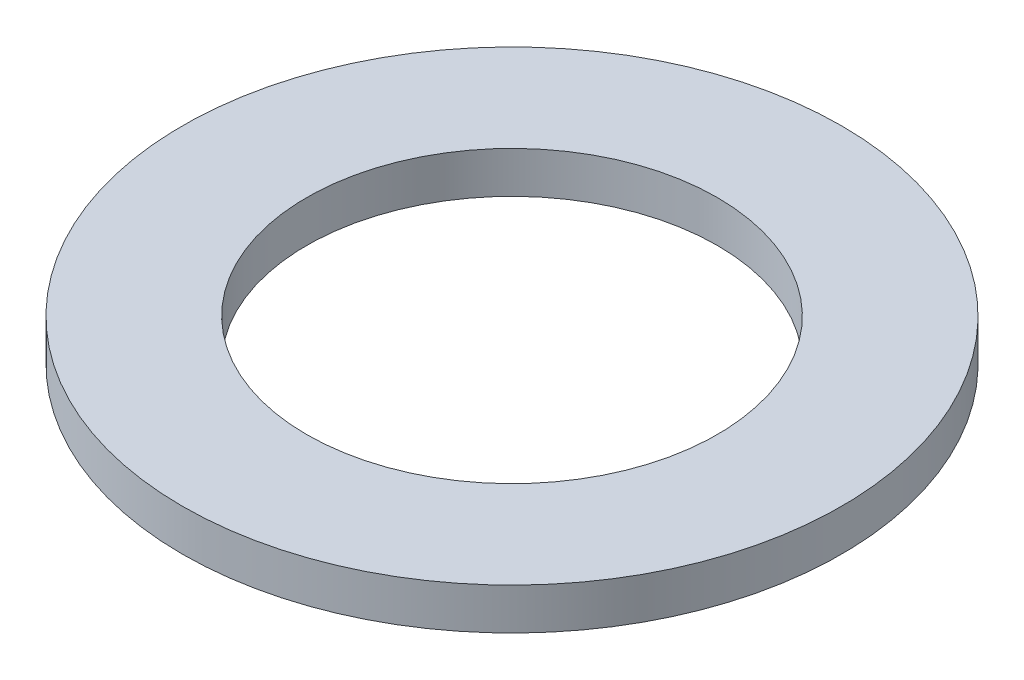
ISO-10303-21;
HEADER;
FILE_DESCRIPTION(('STEP AP214'),'2;1');
FILE_NAME('part.step','',(''),(''),'','','');
FILE_SCHEMA(('AUTOMOTIVE_DESIGN { 1 0 10303 214 1 1 1 1 }'));
ENDSEC;
DATA;
#1=APPLICATION_CONTEXT('core data for automotive mechanical design processes');
#2=APPLICATION_PROTOCOL_DEFINITION('international standard','automotive_design',2000,#1);
#3=PRODUCT_CONTEXT('',#1,'mechanical');
#4=PRODUCT('Part','Part','',(#3));
#5=PRODUCT_RELATED_PRODUCT_CATEGORY('part','',(#4));
#6=PRODUCT_DEFINITION_FORMATION('','',#4);
#7=PRODUCT_DEFINITION_CONTEXT('part definition',#1,'design');
#8=PRODUCT_DEFINITION('design','',#6,#7);
#9=PRODUCT_DEFINITION_SHAPE('','',#8);
#10=(LENGTH_UNIT() NAMED_UNIT(*) SI_UNIT(.MILLI.,.METRE.));
#11=(NAMED_UNIT(*) PLANE_ANGLE_UNIT() SI_UNIT($,.RADIAN.));
#12=(NAMED_UNIT(*) SI_UNIT($,.STERADIAN.) SOLID_ANGLE_UNIT());
#13=UNCERTAINTY_MEASURE_WITH_UNIT(LENGTH_MEASURE(1.E-05),#10,'distance_accuracy_value','');
#14=(GEOMETRIC_REPRESENTATION_CONTEXT(3) GLOBAL_UNCERTAINTY_ASSIGNED_CONTEXT((#13)) GLOBAL_UNIT_ASSIGNED_CONTEXT((#10,
#11,#12)) REPRESENTATION_CONTEXT('',''));
#15=CARTESIAN_POINT('',(0.,0.,0.));
#16=DIRECTION('',(0.,0.,1.));
#17=DIRECTION('',(1.,0.,0.));
#18=AXIS2_PLACEMENT_3D('',#15,#16,#17);
#19=CARTESIAN_POINT('',(0.,1.6,0.));
#20=DIRECTION('',(0.,1.,0.));
#21=DIRECTION('',(0.,0.,1.));
#22=AXIS2_PLACEMENT_3D('',#19,#20,#21);
#23=PLANE('',#22);
#24=CARTESIAN_POINT('',(0.,1.6,0.));
#25=DIRECTION('',(0.,1.,0.));
#26=DIRECTION('',(0.,0.,1.));
#27=AXIS2_PLACEMENT_3D('',#24,#25,#26);
#28=CIRCLE('',#27,12.7);
#29=CARTESIAN_POINT('',(0.,1.6,12.7));
#30=VERTEX_POINT('',#29);
#31=EDGE_CURVE('E10',#30,#30,#28,.T.);
#32=ORIENTED_EDGE('',*,*,#31,.T.);
#33=EDGE_LOOP('',(#32));
#34=FACE_BOUND('',#33,.T.);
#35=CARTESIAN_POINT('',(0.,1.6,0.));
#36=DIRECTION('',(0.,1.,0.));
#37=DIRECTION('',(0.,0.,1.));
#38=AXIS2_PLACEMENT_3D('',#35,#36,#37);
#39=CIRCLE('',#38,7.9121);
#40=CARTESIAN_POINT('',(0.,1.6,7.9121));
#41=VERTEX_POINT('',#40);
#42=EDGE_CURVE('E54',#41,#41,#39,.T.);
#43=ORIENTED_EDGE('',*,*,#42,.F.);
#44=EDGE_LOOP('',(#43));
#45=FACE_BOUND('',#44,.T.);
#46=ADVANCED_FACE('F41',(#34,#45),#23,.T.);
#47=CARTESIAN_POINT('',(0.,0.,0.));
#48=DIRECTION('',(0.,1.,0.));
#49=DIRECTION('',(0.,0.,1.));
#50=AXIS2_PLACEMENT_3D('',#47,#48,#49);
#51=PLANE('',#50);
#52=CARTESIAN_POINT('',(0.,0.,0.));
#53=DIRECTION('',(0.,1.,0.));
#54=DIRECTION('',(0.,0.,1.));
#55=AXIS2_PLACEMENT_3D('',#52,#53,#54);
#56=CIRCLE('',#55,12.7);
#57=CARTESIAN_POINT('',(0.,0.,12.7));
#58=VERTEX_POINT('',#57);
#59=EDGE_CURVE('E45',#58,#58,#56,.T.);
#60=ORIENTED_EDGE('',*,*,#59,.F.);
#61=EDGE_LOOP('',(#60));
#62=FACE_BOUND('',#61,.T.);
#63=CARTESIAN_POINT('',(0.,0.,0.));
#64=DIRECTION('',(0.,1.,0.));
#65=DIRECTION('',(0.,0.,1.));
#66=AXIS2_PLACEMENT_3D('',#63,#64,#65);
#67=CIRCLE('',#66,7.9121);
#68=CARTESIAN_POINT('',(0.,0.,7.9121));
#69=VERTEX_POINT('',#68);
#70=EDGE_CURVE('E56',#69,#69,#67,.T.);
#71=ORIENTED_EDGE('',*,*,#70,.T.);
#72=EDGE_LOOP('',(#71));
#73=FACE_BOUND('',#72,.T.);
#74=ADVANCED_FACE('F68',(#62,#73),#51,.F.);
#75=CARTESIAN_POINT('',(0.,1.6,0.));
#76=DIRECTION('',(0.,-1.,0.));
#77=DIRECTION('',(0.,0.,-1.));
#78=AXIS2_PLACEMENT_3D('',#75,#76,#77);
#79=CYLINDRICAL_SURFACE('',#78,12.7);
#80=ORIENTED_EDGE('',*,*,#31,.F.);
#81=EDGE_LOOP('',(#80));
#82=FACE_BOUND('',#81,.T.);
#83=ORIENTED_EDGE('',*,*,#59,.T.);
#84=EDGE_LOOP('',(#83));
#85=FACE_BOUND('',#84,.T.);
#86=ADVANCED_FACE('F43',(#82,#85),#79,.T.);
#87=CARTESIAN_POINT('',(0.,1.6,0.));
#88=DIRECTION('',(0.,-1.,0.));
#89=DIRECTION('',(0.,0.,-1.));
#90=AXIS2_PLACEMENT_3D('',#87,#88,#89);
#91=CYLINDRICAL_SURFACE('',#90,7.9121);
#92=ORIENTED_EDGE('',*,*,#42,.T.);
#93=EDGE_LOOP('',(#92));
#94=FACE_BOUND('',#93,.T.);
#95=ORIENTED_EDGE('',*,*,#70,.F.);
#96=EDGE_LOOP('',(#95));
#97=FACE_BOUND('',#96,.T.);
#98=ADVANCED_FACE('F64',(#94,#97),#91,.F.);
#99=CLOSED_SHELL('',(#46,#74,#86,#98));
#100=MANIFOLD_SOLID_BREP('B2',#99);
#101=ADVANCED_BREP_SHAPE_REPRESENTATION('',(#18,#100),#14);
#102=SHAPE_DEFINITION_REPRESENTATION(#9,#101);
ENDSEC;
END-ISO-10303-21;
